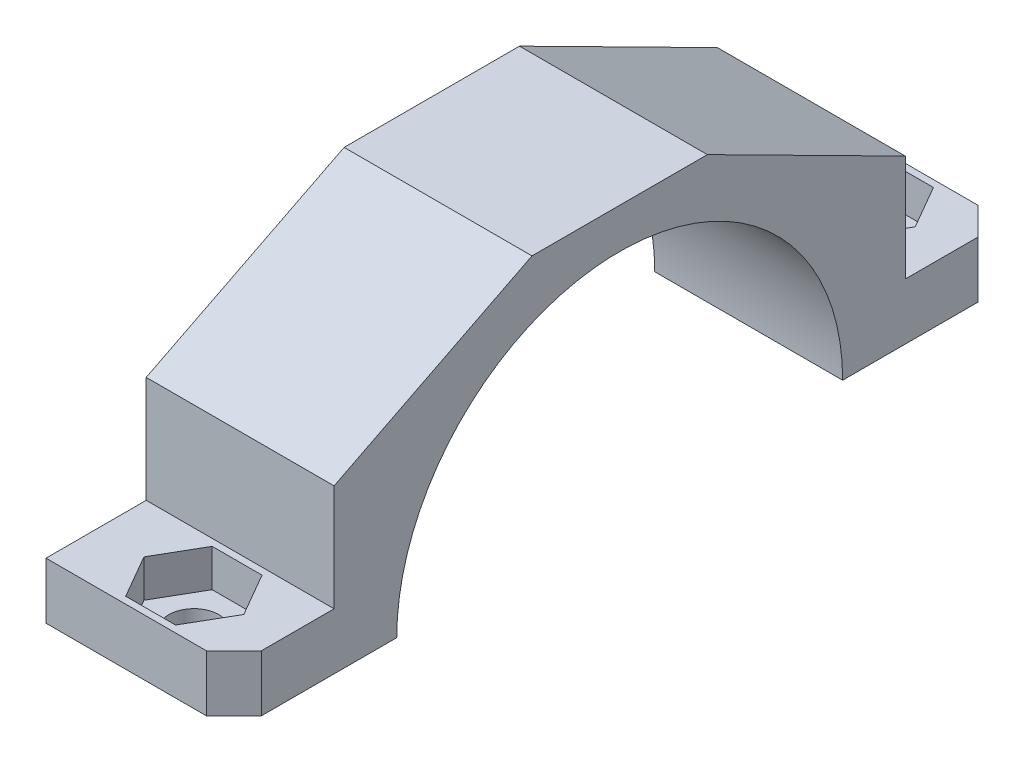
ISO-10303-21;
HEADER;
FILE_DESCRIPTION(('STEP AP214'),'2;1');
FILE_NAME('part.step','',(''),(''),'','','');
FILE_SCHEMA(('AUTOMOTIVE_DESIGN { 1 0 10303 214 1 1 1 1 }'));
ENDSEC;
DATA;
#1=APPLICATION_CONTEXT('core data for automotive mechanical design processes');
#2=APPLICATION_PROTOCOL_DEFINITION('international standard','automotive_design',2000,#1);
#3=PRODUCT_CONTEXT('',#1,'mechanical');
#4=PRODUCT('Part','Part','',(#3));
#5=PRODUCT_RELATED_PRODUCT_CATEGORY('part','',(#4));
#6=PRODUCT_DEFINITION_FORMATION('','',#4);
#7=PRODUCT_DEFINITION_CONTEXT('part definition',#1,'design');
#8=PRODUCT_DEFINITION('design','',#6,#7);
#9=PRODUCT_DEFINITION_SHAPE('','',#8);
#10=(LENGTH_UNIT() NAMED_UNIT(*) SI_UNIT(.MILLI.,.METRE.));
#11=(NAMED_UNIT(*) PLANE_ANGLE_UNIT() SI_UNIT($,.RADIAN.));
#12=(NAMED_UNIT(*) SI_UNIT($,.STERADIAN.) SOLID_ANGLE_UNIT());
#13=UNCERTAINTY_MEASURE_WITH_UNIT(LENGTH_MEASURE(1.E-05),#10,'distance_accuracy_value','');
#14=(GEOMETRIC_REPRESENTATION_CONTEXT(3) GLOBAL_UNCERTAINTY_ASSIGNED_CONTEXT((#13)) GLOBAL_UNIT_ASSIGNED_CONTEXT((#10,
#11,#12)) REPRESENTATION_CONTEXT('',''));
#15=CARTESIAN_POINT('',(0.,0.,0.));
#16=DIRECTION('',(0.,0.,1.));
#17=DIRECTION('',(1.,0.,0.));
#18=AXIS2_PLACEMENT_3D('',#15,#16,#17);
#19=CARTESIAN_POINT('',(0.30524949712385,-20.9999999999997,-26.7999999999997));
#20=DIRECTION('',(0.,-1.,0.));
#21=DIRECTION('',(0.,0.,-1.));
#22=AXIS2_PLACEMENT_3D('',#19,#20,#21);
#23=CYLINDRICAL_SURFACE('',#22,2.);
#24=CARTESIAN_POINT('',(0.30524949712385,0.,-26.7999999999997));
#25=DIRECTION('',(0.,1.,0.));
#26=DIRECTION('',(0.,0.,1.));
#27=AXIS2_PLACEMENT_3D('',#24,#25,#26);
#28=CIRCLE('',#27,2.);
#29=CARTESIAN_POINT('',(0.30524949712385,0.,-24.7999999999997));
#30=VERTEX_POINT('',#29);
#31=EDGE_CURVE('E316',#30,#30,#28,.T.);
#32=ORIENTED_EDGE('',*,*,#31,.F.);
#33=EDGE_LOOP('',(#32));
#34=FACE_BOUND('',#33,.T.);
#35=CARTESIAN_POINT('',(0.30524949712385,1.5,-26.7999999999997));
#36=DIRECTION('',(0.,1.,0.));
#37=DIRECTION('',(0.,0.,1.));
#38=AXIS2_PLACEMENT_3D('',#35,#36,#37);
#39=CIRCLE('',#38,2.);
#40=CARTESIAN_POINT('',(0.30524949712385,1.5,-24.7999999999997));
#41=VERTEX_POINT('',#40);
#42=EDGE_CURVE('E43',#41,#41,#39,.F.);
#43=ORIENTED_EDGE('',*,*,#42,.F.);
#44=EDGE_LOOP('',(#43));
#45=FACE_BOUND('',#44,.T.);
#46=ADVANCED_FACE('F39',(#34,#45),#23,.F.);
#47=CARTESIAN_POINT('',(0.30524949712385,-20.9999999999997,26.8000000000004));
#48=DIRECTION('',(0.,-1.,0.));
#49=DIRECTION('',(0.,0.,-1.));
#50=AXIS2_PLACEMENT_3D('',#47,#48,#49);
#51=CYLINDRICAL_SURFACE('',#50,2.);
#52=CARTESIAN_POINT('',(0.30524949712385,0.,26.8000000000004));
#53=DIRECTION('',(0.,1.,0.));
#54=DIRECTION('',(0.,0.,1.));
#55=AXIS2_PLACEMENT_3D('',#52,#53,#54);
#56=CIRCLE('',#55,2.);
#57=CARTESIAN_POINT('',(0.30524949712385,0.,28.8000000000004));
#58=VERTEX_POINT('',#57);
#59=EDGE_CURVE('E320',#58,#58,#56,.T.);
#60=ORIENTED_EDGE('',*,*,#59,.F.);
#61=EDGE_LOOP('',(#60));
#62=FACE_BOUND('',#61,.T.);
#63=CARTESIAN_POINT('',(0.30524949712385,1.5,26.8000000000004));
#64=DIRECTION('',(0.,1.,0.));
#65=DIRECTION('',(0.,0.,1.));
#66=AXIS2_PLACEMENT_3D('',#63,#64,#65);
#67=CIRCLE('',#66,2.);
#68=CARTESIAN_POINT('',(0.30524949712385,1.5,28.8000000000004));
#69=VERTEX_POINT('',#68);
#70=EDGE_CURVE('E262',#69,#69,#67,.F.);
#71=ORIENTED_EDGE('',*,*,#70,.F.);
#72=EDGE_LOOP('',(#71));
#73=FACE_BOUND('',#72,.T.);
#74=ADVANCED_FACE('F430',(#62,#73),#51,.F.);
#75=CARTESIAN_POINT('',(7.5,4.5,-22.8));
#76=DIRECTION('',(0.,-1.,0.));
#77=DIRECTION('',(0.,0.,-1.));
#78=AXIS2_PLACEMENT_3D('',#75,#76,#77);
#79=PLANE('',#78);
#80=DIRECTION('',(0.5,0.,0.866025403784439));
#81=VECTOR('',#80,1.);
#82=CARTESIAN_POINT('',(-3.67846736028479,4.5,-26.7999999999997));
#83=LINE('',#82,#81);
#84=CARTESIAN_POINT('',(-3.67846736028479,4.5,-26.7999999999997));
#85=VERTEX_POINT('',#84);
#86=CARTESIAN_POINT('',(-1.68660893158059,4.5,-23.3499999999997));
#87=VERTEX_POINT('',#86);
#88=EDGE_CURVE('E296',#85,#87,#83,.T.);
#89=ORIENTED_EDGE('',*,*,#88,.F.);
#90=DIRECTION('',(-0.5,0.,0.866025403784439));
#91=VECTOR('',#90,1.);
#92=CARTESIAN_POINT('',(-1.68660893158058,4.5,-30.2499999999997));
#93=LINE('',#92,#91);
#94=CARTESIAN_POINT('',(-1.68660893158058,4.5,-30.2499999999997));
#95=VERTEX_POINT('',#94);
#96=EDGE_CURVE('E56',#95,#85,#93,.T.);
#97=ORIENTED_EDGE('',*,*,#96,.F.);
#98=DIRECTION('',(-1.,0.,0.));
#99=VECTOR('',#98,1.);
#100=CARTESIAN_POINT('',(2.29710792582784,4.5,-30.2499999999997));
#101=LINE('',#100,#99);
#102=CARTESIAN_POINT('',(2.29710792582784,4.5,-30.2499999999997));
#103=VERTEX_POINT('',#102);
#104=EDGE_CURVE('E283',#103,#95,#101,.T.);
#105=ORIENTED_EDGE('',*,*,#104,.F.);
#106=DIRECTION('',(-0.5,0.,-0.866025403784439));
#107=VECTOR('',#106,1.);
#108=CARTESIAN_POINT('',(4.28896635453205,4.5,-26.7999999999997));
#109=LINE('',#108,#107);
#110=CARTESIAN_POINT('',(4.28896635453205,4.5,-26.7999999999997));
#111=VERTEX_POINT('',#110);
#112=EDGE_CURVE('E286',#111,#103,#109,.T.);
#113=ORIENTED_EDGE('',*,*,#112,.F.);
#114=DIRECTION('',(0.5,0.,-0.866025403784439));
#115=VECTOR('',#114,1.);
#116=CARTESIAN_POINT('',(2.29710792582784,4.5,-23.3499999999997));
#117=LINE('',#116,#115);
#118=CARTESIAN_POINT('',(2.29710792582784,4.5,-23.3499999999997));
#119=VERTEX_POINT('',#118);
#120=EDGE_CURVE('E290',#119,#111,#117,.T.);
#121=ORIENTED_EDGE('',*,*,#120,.F.);
#122=DIRECTION('',(1.,0.,0.));
#123=VECTOR('',#122,1.);
#124=CARTESIAN_POINT('',(-1.68660893158059,4.5,-23.3499999999997));
#125=LINE('',#124,#123);
#126=EDGE_CURVE('E293',#87,#119,#125,.T.);
#127=ORIENTED_EDGE('',*,*,#126,.F.);
#128=EDGE_LOOP('',(#89,#97,#105,#113,#121,#127));
#129=FACE_BOUND('',#128,.T.);
#130=DIRECTION('',(0.,0.,1.));
#131=VECTOR('',#130,1.);
#132=CARTESIAN_POINT('',(7.5,4.5,-22.8));
#133=LINE('',#132,#131);
#134=CARTESIAN_POINT('',(7.5,4.5,-28.6052494971222));
#135=VERTEX_POINT('',#134);
#136=CARTESIAN_POINT('',(7.5,4.5,-22.8));
#137=VERTEX_POINT('',#136);
#138=EDGE_CURVE('E352',#135,#137,#133,.T.);
#139=ORIENTED_EDGE('',*,*,#138,.F.);
#140=DIRECTION('',(-0.707106781186548,0.,-0.707106781186547));
#141=VECTOR('',#140,1.);
#142=CARTESIAN_POINT('',(10.4026247485611,4.5,-25.7026247485611));
#143=LINE('',#142,#141);
#144=CARTESIAN_POINT('',(5.30524949712216,4.50000000000001,-30.8));
#145=VERTEX_POINT('',#144);
#146=EDGE_CURVE('E332',#135,#145,#143,.T.);
#147=ORIENTED_EDGE('',*,*,#146,.T.);
#148=DIRECTION('',(-1.,0.,0.));
#149=VECTOR('',#148,1.);
#150=CARTESIAN_POINT('',(7.5,4.5,-30.8));
#151=LINE('',#150,#149);
#152=CARTESIAN_POINT('',(-7.5,4.5,-30.8));
#153=VERTEX_POINT('',#152);
#154=EDGE_CURVE('E399',#145,#153,#151,.T.);
#155=ORIENTED_EDGE('',*,*,#154,.T.);
#156=DIRECTION('',(0.,0.,1.));
#157=VECTOR('',#156,1.);
#158=CARTESIAN_POINT('',(-7.5,4.5,-22.8));
#159=LINE('',#158,#157);
#160=CARTESIAN_POINT('',(-7.5,4.5,-22.8));
#161=VERTEX_POINT('',#160);
#162=EDGE_CURVE('E381',#153,#161,#159,.T.);
#163=ORIENTED_EDGE('',*,*,#162,.T.);
#164=DIRECTION('',(-1.,0.,0.));
#165=VECTOR('',#164,1.);
#166=CARTESIAN_POINT('',(7.5,4.5,-22.8));
#167=LINE('',#166,#165);
#168=EDGE_CURVE('E396',#137,#161,#167,.T.);
#169=ORIENTED_EDGE('',*,*,#168,.F.);
#170=EDGE_LOOP('',(#139,#147,#155,#163,#169));
#171=FACE_BOUND('',#170,.T.);
#172=ADVANCED_FACE('F437',(#129,#171),#79,.F.);
#173=CARTESIAN_POINT('',(7.5,13.,22.8));
#174=DIRECTION('',(0.,-0.892157158155219,-0.451725143369731));
#175=DIRECTION('',(0.,0.451725143369731,-0.892157158155219));
#176=AXIS2_PLACEMENT_3D('',#173,#174,#175);
#177=PLANE('',#176);
#178=DIRECTION('',(0.,-0.451725143369731,0.892157158155219));
#179=VECTOR('',#178,1.);
#180=CARTESIAN_POINT('',(-7.5,13.,22.8));
#181=LINE('',#180,#179);
#182=CARTESIAN_POINT('',(-7.5,21.,7.));
#183=VERTEX_POINT('',#182);
#184=CARTESIAN_POINT('',(-7.5,13.,22.8));
#185=VERTEX_POINT('',#184);
#186=EDGE_CURVE('E335',#183,#185,#181,.T.);
#187=ORIENTED_EDGE('',*,*,#186,.T.);
#188=DIRECTION('',(-1.,0.,0.));
#189=VECTOR('',#188,1.);
#190=CARTESIAN_POINT('',(7.5,13.,22.8));
#191=LINE('',#190,#189);
#192=CARTESIAN_POINT('',(7.5,13.,22.8));
#193=VERTEX_POINT('',#192);
#194=EDGE_CURVE('E416',#193,#185,#191,.T.);
#195=ORIENTED_EDGE('',*,*,#194,.F.);
#196=DIRECTION('',(0.,-0.451725143369731,0.892157158155219));
#197=VECTOR('',#196,1.);
#198=CARTESIAN_POINT('',(7.5,13.,22.8));
#199=LINE('',#198,#197);
#200=CARTESIAN_POINT('',(7.5,21.,7.));
#201=VERTEX_POINT('',#200);
#202=EDGE_CURVE('E336',#201,#193,#199,.T.);
#203=ORIENTED_EDGE('',*,*,#202,.F.);
#204=DIRECTION('',(-1.,0.,0.));
#205=VECTOR('',#204,1.);
#206=CARTESIAN_POINT('',(7.5,21.,7.));
#207=LINE('',#206,#205);
#208=EDGE_CURVE('E360',#201,#183,#207,.T.);
#209=ORIENTED_EDGE('',*,*,#208,.T.);
#210=EDGE_LOOP('',(#187,#195,#203,#209));
#211=FACE_BOUND('',#210,.T.);
#212=ADVANCED_FACE('F41',(#211),#177,.F.);
#213=CARTESIAN_POINT('',(7.5,4.5,22.8));
#214=DIRECTION('',(0.,0.,-1.));
#215=DIRECTION('',(-1.,0.,0.));
#216=AXIS2_PLACEMENT_3D('',#213,#214,#215);
#217=PLANE('',#216);
#218=DIRECTION('',(0.,-1.,0.));
#219=VECTOR('',#218,1.);
#220=CARTESIAN_POINT('',(-7.5,4.5,22.8));
#221=LINE('',#220,#219);
#222=CARTESIAN_POINT('',(-7.5,4.5,22.8));
#223=VERTEX_POINT('',#222);
#224=EDGE_CURVE('E363',#185,#223,#221,.T.);
#225=ORIENTED_EDGE('',*,*,#224,.T.);
#226=DIRECTION('',(-1.,0.,0.));
#227=VECTOR('',#226,1.);
#228=CARTESIAN_POINT('',(7.5,4.5,22.8));
#229=LINE('',#228,#227);
#230=CARTESIAN_POINT('',(7.5,4.5,22.8));
#231=VERTEX_POINT('',#230);
#232=EDGE_CURVE('E413',#231,#223,#229,.T.);
#233=ORIENTED_EDGE('',*,*,#232,.F.);
#234=DIRECTION('',(0.,-1.,0.));
#235=VECTOR('',#234,1.);
#236=CARTESIAN_POINT('',(7.5,4.5,22.8));
#237=LINE('',#236,#235);
#238=EDGE_CURVE('E339',#193,#231,#237,.T.);
#239=ORIENTED_EDGE('',*,*,#238,.F.);
#240=ORIENTED_EDGE('',*,*,#194,.T.);
#241=EDGE_LOOP('',(#225,#233,#239,#240));
#242=FACE_BOUND('',#241,.T.);
#243=ADVANCED_FACE('F495',(#242),#217,.F.);
#244=CARTESIAN_POINT('',(7.5,4.5,30.8));
#245=DIRECTION('',(0.,-1.,0.));
#246=DIRECTION('',(0.,0.,-1.));
#247=AXIS2_PLACEMENT_3D('',#244,#245,#246);
#248=PLANE('',#247);
#249=DIRECTION('',(0.5,0.,0.866025403784439));
#250=VECTOR('',#249,1.);
#251=CARTESIAN_POINT('',(-3.67846736028479,4.5,26.8000000000004));
#252=LINE('',#251,#250);
#253=CARTESIAN_POINT('',(-3.6784673602848,4.5,26.8000000000004));
#254=VERTEX_POINT('',#253);
#255=CARTESIAN_POINT('',(-1.68660893158058,4.5,30.2500000000004));
#256=VERTEX_POINT('',#255);
#257=EDGE_CURVE('E250',#254,#256,#252,.T.);
#258=ORIENTED_EDGE('',*,*,#257,.F.);
#259=DIRECTION('',(-0.500000000000001,0.,0.866025403784438));
#260=VECTOR('',#259,1.);
#261=CARTESIAN_POINT('',(-1.68660893158058,4.5,23.3500000000004));
#262=LINE('',#261,#260);
#263=CARTESIAN_POINT('',(-1.68660893158058,4.5,23.3500000000004));
#264=VERTEX_POINT('',#263);
#265=EDGE_CURVE('E64',#264,#254,#262,.T.);
#266=ORIENTED_EDGE('',*,*,#265,.F.);
#267=DIRECTION('',(-1.,0.,0.));
#268=VECTOR('',#267,1.);
#269=CARTESIAN_POINT('',(2.29710792582784,4.5,23.3500000000004));
#270=LINE('',#269,#268);
#271=CARTESIAN_POINT('',(2.29710792582784,4.5,23.3500000000004));
#272=VERTEX_POINT('',#271);
#273=EDGE_CURVE('E236',#272,#264,#270,.T.);
#274=ORIENTED_EDGE('',*,*,#273,.F.);
#275=DIRECTION('',(-0.5,0.,-0.866025403784439));
#276=VECTOR('',#275,1.);
#277=CARTESIAN_POINT('',(4.28896635453205,4.5,26.8000000000004));
#278=LINE('',#277,#276);
#279=CARTESIAN_POINT('',(4.28896635453205,4.5,26.8000000000004));
#280=VERTEX_POINT('',#279);
#281=EDGE_CURVE('E239',#280,#272,#278,.T.);
#282=ORIENTED_EDGE('',*,*,#281,.F.);
#283=DIRECTION('',(0.5,0.,-0.866025403784439));
#284=VECTOR('',#283,1.);
#285=CARTESIAN_POINT('',(2.29710792582784,4.5,30.2500000000004));
#286=LINE('',#285,#284);
#287=CARTESIAN_POINT('',(2.29710792582784,4.5,30.2500000000004));
#288=VERTEX_POINT('',#287);
#289=EDGE_CURVE('E255',#288,#280,#286,.T.);
#290=ORIENTED_EDGE('',*,*,#289,.F.);
#291=DIRECTION('',(1.,0.,0.));
#292=VECTOR('',#291,1.);
#293=CARTESIAN_POINT('',(-1.68660893158058,4.5,30.2500000000004));
#294=LINE('',#293,#292);
#295=EDGE_CURVE('E252',#256,#288,#294,.T.);
#296=ORIENTED_EDGE('',*,*,#295,.F.);
#297=EDGE_LOOP('',(#258,#266,#274,#282,#290,#296));
#298=FACE_BOUND('',#297,.T.);
#299=DIRECTION('',(-1.,0.,0.));
#300=VECTOR('',#299,1.);
#301=CARTESIAN_POINT('',(7.5,4.5,30.8));
#302=LINE('',#301,#300);
#303=CARTESIAN_POINT('',(5.30524949712216,4.50000000000001,30.8));
#304=VERTEX_POINT('',#303);
#305=CARTESIAN_POINT('',(-7.5,4.5,30.8));
#306=VERTEX_POINT('',#305);
#307=EDGE_CURVE('E411',#304,#306,#302,.T.);
#308=ORIENTED_EDGE('',*,*,#307,.F.);
#309=DIRECTION('',(0.70710678118655,0.,-0.707106781186545));
#310=VECTOR('',#309,1.);
#311=CARTESIAN_POINT('',(6.40262474856109,4.5,29.7026247485611));
#312=LINE('',#311,#310);
#313=CARTESIAN_POINT('',(7.5,4.50000000000001,28.6052494971222));
#314=VERTEX_POINT('',#313);
#315=EDGE_CURVE('E327',#304,#314,#312,.T.);
#316=ORIENTED_EDGE('',*,*,#315,.T.);
#317=DIRECTION('',(0.,0.,1.));
#318=VECTOR('',#317,1.);
#319=CARTESIAN_POINT('',(7.5,4.5,30.8));
#320=LINE('',#319,#318);
#321=EDGE_CURVE('E342',#231,#314,#320,.T.);
#322=ORIENTED_EDGE('',*,*,#321,.F.);
#323=ORIENTED_EDGE('',*,*,#232,.T.);
#324=DIRECTION('',(0.,0.,1.));
#325=VECTOR('',#324,1.);
#326=CARTESIAN_POINT('',(-7.5,4.5,30.8));
#327=LINE('',#326,#325);
#328=EDGE_CURVE('E365',#223,#306,#327,.T.);
#329=ORIENTED_EDGE('',*,*,#328,.T.);
#330=EDGE_LOOP('',(#308,#316,#322,#323,#329));
#331=FACE_BOUND('',#330,.T.);
#332=ADVANCED_FACE('F492',(#298,#331),#248,.F.);
#333=CARTESIAN_POINT('',(7.5,0.,30.8));
#334=DIRECTION('',(0.,0.,-1.));
#335=DIRECTION('',(-1.,0.,0.));
#336=AXIS2_PLACEMENT_3D('',#333,#334,#335);
#337=PLANE('',#336);
#338=DIRECTION('',(-1.,0.,0.));
#339=VECTOR('',#338,1.);
#340=CARTESIAN_POINT('',(7.5,0.,30.8));
#341=LINE('',#340,#339);
#342=CARTESIAN_POINT('',(5.30524949712216,0.,30.8));
#343=VERTEX_POINT('',#342);
#344=CARTESIAN_POINT('',(-7.5,0.,30.8));
#345=VERTEX_POINT('',#344);
#346=EDGE_CURVE('E409',#343,#345,#341,.T.);
#347=ORIENTED_EDGE('',*,*,#346,.F.);
#348=DIRECTION('',(0.,-1.,0.));
#349=VECTOR('',#348,1.);
#350=CARTESIAN_POINT('',(5.30524949712216,21.,30.8));
#351=LINE('',#350,#349);
#352=EDGE_CURVE('E319',#304,#343,#351,.T.);
#353=ORIENTED_EDGE('',*,*,#352,.F.);
#354=ORIENTED_EDGE('',*,*,#307,.T.);
#355=DIRECTION('',(0.,-1.,0.));
#356=VECTOR('',#355,1.);
#357=CARTESIAN_POINT('',(-7.5,0.,30.8));
#358=LINE('',#357,#356);
#359=EDGE_CURVE('E368',#306,#345,#358,.T.);
#360=ORIENTED_EDGE('',*,*,#359,.T.);
#361=EDGE_LOOP('',(#347,#353,#354,#360));
#362=FACE_BOUND('',#361,.T.);
#363=ADVANCED_FACE('F488',(#362),#337,.F.);
#364=CARTESIAN_POINT('',(7.5,0.,30.8));
#365=DIRECTION('',(0.,1.,0.));
#366=DIRECTION('',(0.,0.,1.));
#367=AXIS2_PLACEMENT_3D('',#364,#365,#366);
#368=PLANE('',#367);
#369=ORIENTED_EDGE('',*,*,#59,.T.);
#370=EDGE_LOOP('',(#369));
#371=FACE_BOUND('',#370,.T.);
#372=DIRECTION('',(0.,0.,-1.));
#373=VECTOR('',#372,1.);
#374=CARTESIAN_POINT('',(7.5,0.,30.8));
#375=LINE('',#374,#373);
#376=CARTESIAN_POINT('',(7.5,0.,28.6052494971222));
#377=VERTEX_POINT('',#376);
#378=CARTESIAN_POINT('',(7.5,0.,17.8));
#379=VERTEX_POINT('',#378);
#380=EDGE_CURVE('E345',#377,#379,#375,.T.);
#381=ORIENTED_EDGE('',*,*,#380,.F.);
#382=DIRECTION('',(0.70710678118655,0.,-0.707106781186545));
#383=VECTOR('',#382,1.);
#384=CARTESIAN_POINT('',(5.30524949712216,0.,30.8));
#385=LINE('',#384,#383);
#386=EDGE_CURVE('E324',#343,#377,#385,.T.);
#387=ORIENTED_EDGE('',*,*,#386,.F.);
#388=ORIENTED_EDGE('',*,*,#346,.T.);
#389=DIRECTION('',(0.,0.,-1.));
#390=VECTOR('',#389,1.);
#391=CARTESIAN_POINT('',(-7.5,0.,30.8));
#392=LINE('',#391,#390);
#393=CARTESIAN_POINT('',(-7.5,0.,17.8));
#394=VERTEX_POINT('',#393);
#395=EDGE_CURVE('E371',#345,#394,#392,.T.);
#396=ORIENTED_EDGE('',*,*,#395,.T.);
#397=DIRECTION('',(-1.,0.,0.));
#398=VECTOR('',#397,1.);
#399=CARTESIAN_POINT('',(7.5,0.,17.8));
#400=LINE('',#399,#398);
#401=EDGE_CURVE('E406',#379,#394,#400,.T.);
#402=ORIENTED_EDGE('',*,*,#401,.F.);
#403=EDGE_LOOP('',(#381,#387,#388,#396,#402));
#404=FACE_BOUND('',#403,.T.);
#405=ADVANCED_FACE('F484',(#371,#404),#368,.F.);
#406=CARTESIAN_POINT('',(7.5,0.,0.));
#407=DIRECTION('',(-1.,0.,0.));
#408=DIRECTION('',(0.,0.,1.));
#409=AXIS2_PLACEMENT_3D('',#406,#407,#408);
#410=CYLINDRICAL_SURFACE('',#409,17.8);
#411=CARTESIAN_POINT('',(-7.5,0.,0.));
#412=DIRECTION('',(-1.,0.,0.));
#413=DIRECTION('',(0.,0.,1.));
#414=AXIS2_PLACEMENT_3D('',#411,#412,#413);
#415=CIRCLE('',#414,17.8);
#416=CARTESIAN_POINT('',(-7.5,0.,-17.8));
#417=VERTEX_POINT('',#416);
#418=EDGE_CURVE('E373',#394,#417,#415,.T.);
#419=ORIENTED_EDGE('',*,*,#418,.T.);
#420=DIRECTION('',(-1.,0.,0.));
#421=VECTOR('',#420,1.);
#422=CARTESIAN_POINT('',(7.5,0.,-17.8));
#423=LINE('',#422,#421);
#424=CARTESIAN_POINT('',(7.5,0.,-17.8));
#425=VERTEX_POINT('',#424);
#426=EDGE_CURVE('E403',#425,#417,#423,.T.);
#427=ORIENTED_EDGE('',*,*,#426,.F.);
#428=CARTESIAN_POINT('',(7.5,0.,0.));
#429=DIRECTION('',(-1.,0.,0.));
#430=DIRECTION('',(0.,0.,1.));
#431=AXIS2_PLACEMENT_3D('',#428,#429,#430);
#432=CIRCLE('',#431,17.8);
#433=EDGE_CURVE('E347',#379,#425,#432,.T.);
#434=ORIENTED_EDGE('',*,*,#433,.F.);
#435=ORIENTED_EDGE('',*,*,#401,.T.);
#436=EDGE_LOOP('',(#419,#427,#434,#435));
#437=FACE_BOUND('',#436,.T.);
#438=ADVANCED_FACE('F480',(#437),#410,.F.);
#439=CARTESIAN_POINT('',(7.5,0.,-17.8));
#440=DIRECTION('',(0.,1.,0.));
#441=DIRECTION('',(0.,0.,1.));
#442=AXIS2_PLACEMENT_3D('',#439,#440,#441);
#443=PLANE('',#442);
#444=ORIENTED_EDGE('',*,*,#31,.T.);
#445=EDGE_LOOP('',(#444));
#446=FACE_BOUND('',#445,.T.);
#447=DIRECTION('',(-1.,0.,0.));
#448=VECTOR('',#447,1.);
#449=CARTESIAN_POINT('',(7.5,0.,-30.8));
#450=LINE('',#449,#448);
#451=CARTESIAN_POINT('',(5.30524949712216,0.,-30.8));
#452=VERTEX_POINT('',#451);
#453=CARTESIAN_POINT('',(-7.5,0.,-30.8));
#454=VERTEX_POINT('',#453);
#455=EDGE_CURVE('E401',#452,#454,#450,.T.);
#456=ORIENTED_EDGE('',*,*,#455,.F.);
#457=DIRECTION('',(-0.707106781186548,0.,-0.707106781186547));
#458=VECTOR('',#457,1.);
#459=CARTESIAN_POINT('',(5.30524949712216,0.,-30.8));
#460=LINE('',#459,#458);
#461=CARTESIAN_POINT('',(7.5,0.,-28.6052494971222));
#462=VERTEX_POINT('',#461);
#463=EDGE_CURVE('E321',#462,#452,#460,.T.);
#464=ORIENTED_EDGE('',*,*,#463,.F.);
#465=DIRECTION('',(0.,0.,-1.));
#466=VECTOR('',#465,1.);
#467=CARTESIAN_POINT('',(7.5,0.,-17.8));
#468=LINE('',#467,#466);
#469=EDGE_CURVE('E349',#425,#462,#468,.T.);
#470=ORIENTED_EDGE('',*,*,#469,.F.);
#471=ORIENTED_EDGE('',*,*,#426,.T.);
#472=DIRECTION('',(0.,0.,-1.));
#473=VECTOR('',#472,1.);
#474=CARTESIAN_POINT('',(-7.5,0.,-17.8));
#475=LINE('',#474,#473);
#476=EDGE_CURVE('E375',#417,#454,#475,.T.);
#477=ORIENTED_EDGE('',*,*,#476,.T.);
#478=EDGE_LOOP('',(#456,#464,#470,#471,#477));
#479=FACE_BOUND('',#478,.T.);
#480=ADVANCED_FACE('F477',(#446,#479),#443,.F.);
#481=CARTESIAN_POINT('',(7.5,4.5,-30.8));
#482=DIRECTION('',(0.,0.,1.));
#483=DIRECTION('',(1.,0.,0.));
#484=AXIS2_PLACEMENT_3D('',#481,#482,#483);
#485=PLANE('',#484);
#486=ORIENTED_EDGE('',*,*,#154,.F.);
#487=DIRECTION('',(0.,-1.,0.));
#488=VECTOR('',#487,1.);
#489=CARTESIAN_POINT('',(5.30524949712216,21.,-30.8));
#490=LINE('',#489,#488);
#491=EDGE_CURVE('E323',#145,#452,#490,.T.);
#492=ORIENTED_EDGE('',*,*,#491,.T.);
#493=ORIENTED_EDGE('',*,*,#455,.T.);
#494=DIRECTION('',(0.,1.,0.));
#495=VECTOR('',#494,1.);
#496=CARTESIAN_POINT('',(-7.5,4.5,-30.8));
#497=LINE('',#496,#495);
#498=EDGE_CURVE('E378',#454,#153,#497,.T.);
#499=ORIENTED_EDGE('',*,*,#498,.T.);
#500=EDGE_LOOP('',(#486,#492,#493,#499));
#501=FACE_BOUND('',#500,.T.);
#502=ADVANCED_FACE('F470',(#501),#485,.F.);
#503=CARTESIAN_POINT('',(7.5,13.,-22.8));
#504=DIRECTION('',(0.,0.,1.));
#505=DIRECTION('',(1.,0.,0.));
#506=AXIS2_PLACEMENT_3D('',#503,#504,#505);
#507=PLANE('',#506);
#508=DIRECTION('',(0.,1.,0.));
#509=VECTOR('',#508,1.);
#510=CARTESIAN_POINT('',(-7.5,13.,-22.8));
#511=LINE('',#510,#509);
#512=CARTESIAN_POINT('',(-7.5,13.,-22.8));
#513=VERTEX_POINT('',#512);
#514=EDGE_CURVE('E383',#161,#513,#511,.T.);
#515=ORIENTED_EDGE('',*,*,#514,.T.);
#516=DIRECTION('',(-1.,0.,0.));
#517=VECTOR('',#516,1.);
#518=CARTESIAN_POINT('',(7.5,13.,-22.8));
#519=LINE('',#518,#517);
#520=CARTESIAN_POINT('',(7.5,13.,-22.8));
#521=VERTEX_POINT('',#520);
#522=EDGE_CURVE('E393',#521,#513,#519,.T.);
#523=ORIENTED_EDGE('',*,*,#522,.F.);
#524=DIRECTION('',(0.,1.,0.));
#525=VECTOR('',#524,1.);
#526=CARTESIAN_POINT('',(7.5,13.,-22.8));
#527=LINE('',#526,#525);
#528=EDGE_CURVE('E354',#137,#521,#527,.T.);
#529=ORIENTED_EDGE('',*,*,#528,.F.);
#530=ORIENTED_EDGE('',*,*,#168,.T.);
#531=EDGE_LOOP('',(#515,#523,#529,#530));
#532=FACE_BOUND('',#531,.T.);
#533=ADVANCED_FACE('F466',(#532),#507,.F.);
#534=CARTESIAN_POINT('',(7.5,21.,-7.));
#535=DIRECTION('',(0.,-0.892157158155219,0.451725143369731));
#536=DIRECTION('',(0.,-0.451725143369731,-0.892157158155219));
#537=AXIS2_PLACEMENT_3D('',#534,#535,#536);
#538=PLANE('',#537);
#539=DIRECTION('',(0.,0.451725143369731,0.892157158155219));
#540=VECTOR('',#539,1.);
#541=CARTESIAN_POINT('',(-7.5,21.,-7.));
#542=LINE('',#541,#540);
#543=CARTESIAN_POINT('',(-7.5,21.,-7.));
#544=VERTEX_POINT('',#543);
#545=EDGE_CURVE('E385',#513,#544,#542,.T.);
#546=ORIENTED_EDGE('',*,*,#545,.T.);
#547=DIRECTION('',(-1.,0.,0.));
#548=VECTOR('',#547,1.);
#549=CARTESIAN_POINT('',(7.5,21.,-7.));
#550=LINE('',#549,#548);
#551=CARTESIAN_POINT('',(7.5,21.,-7.));
#552=VERTEX_POINT('',#551);
#553=EDGE_CURVE('E390',#552,#544,#550,.T.);
#554=ORIENTED_EDGE('',*,*,#553,.F.);
#555=DIRECTION('',(0.,0.451725143369731,0.892157158155219));
#556=VECTOR('',#555,1.);
#557=CARTESIAN_POINT('',(7.5,21.,-7.));
#558=LINE('',#557,#556);
#559=EDGE_CURVE('E356',#521,#552,#558,.T.);
#560=ORIENTED_EDGE('',*,*,#559,.F.);
#561=ORIENTED_EDGE('',*,*,#522,.T.);
#562=EDGE_LOOP('',(#546,#554,#560,#561));
#563=FACE_BOUND('',#562,.T.);
#564=ADVANCED_FACE('F462',(#563),#538,.F.);
#565=CARTESIAN_POINT('',(7.5,21.,7.));
#566=DIRECTION('',(0.,-1.,0.));
#567=DIRECTION('',(0.,0.,-1.));
#568=AXIS2_PLACEMENT_3D('',#565,#566,#567);
#569=PLANE('',#568);
#570=DIRECTION('',(0.,0.,1.));
#571=VECTOR('',#570,1.);
#572=CARTESIAN_POINT('',(-7.5,21.,7.));
#573=LINE('',#572,#571);
#574=EDGE_CURVE('E340',#544,#183,#573,.T.);
#575=ORIENTED_EDGE('',*,*,#574,.T.);
#576=ORIENTED_EDGE('',*,*,#208,.F.);
#577=DIRECTION('',(0.,0.,1.));
#578=VECTOR('',#577,1.);
#579=CARTESIAN_POINT('',(7.5,21.,7.));
#580=LINE('',#579,#578);
#581=EDGE_CURVE('E358',#552,#201,#580,.T.);
#582=ORIENTED_EDGE('',*,*,#581,.F.);
#583=ORIENTED_EDGE('',*,*,#553,.T.);
#584=EDGE_LOOP('',(#575,#576,#582,#583));
#585=FACE_BOUND('',#584,.T.);
#586=ADVANCED_FACE('F455',(#585),#569,.F.);
#587=CARTESIAN_POINT('',(7.5,0.,0.));
#588=DIRECTION('',(-1.,0.,0.));
#589=DIRECTION('',(0.,0.,1.));
#590=AXIS2_PLACEMENT_3D('',#587,#588,#589);
#591=PLANE('',#590);
#592=ORIENTED_EDGE('',*,*,#469,.T.);
#593=DIRECTION('',(0.,1.,0.));
#594=VECTOR('',#593,1.);
#595=CARTESIAN_POINT('',(7.5,0.,-28.6052494971222));
#596=LINE('',#595,#594);
#597=EDGE_CURVE('E11',#462,#135,#596,.T.);
#598=ORIENTED_EDGE('',*,*,#597,.T.);
#599=ORIENTED_EDGE('',*,*,#138,.T.);
#600=ORIENTED_EDGE('',*,*,#528,.T.);
#601=ORIENTED_EDGE('',*,*,#559,.T.);
#602=ORIENTED_EDGE('',*,*,#581,.T.);
#603=ORIENTED_EDGE('',*,*,#202,.T.);
#604=ORIENTED_EDGE('',*,*,#238,.T.);
#605=ORIENTED_EDGE('',*,*,#321,.T.);
#606=DIRECTION('',(0.,-1.,0.));
#607=VECTOR('',#606,1.);
#608=CARTESIAN_POINT('',(7.5,0.,28.6052494971222));
#609=LINE('',#608,#607);
#610=EDGE_CURVE('E48',#314,#377,#609,.T.);
#611=ORIENTED_EDGE('',*,*,#610,.T.);
#612=ORIENTED_EDGE('',*,*,#380,.T.);
#613=ORIENTED_EDGE('',*,*,#433,.T.);
#614=EDGE_LOOP('',(#592,#598,#599,#600,#601,#602,#603,#604,#605,#611,#612,#613));
#615=FACE_BOUND('',#614,.T.);
#616=ADVANCED_FACE('F452',(#615),#591,.F.);
#617=CARTESIAN_POINT('',(-7.5,0.,0.));
#618=DIRECTION('',(-1.,0.,0.));
#619=DIRECTION('',(0.,0.,1.));
#620=AXIS2_PLACEMENT_3D('',#617,#618,#619);
#621=PLANE('',#620);
#622=ORIENTED_EDGE('',*,*,#186,.F.);
#623=ORIENTED_EDGE('',*,*,#574,.F.);
#624=ORIENTED_EDGE('',*,*,#545,.F.);
#625=ORIENTED_EDGE('',*,*,#514,.F.);
#626=ORIENTED_EDGE('',*,*,#162,.F.);
#627=ORIENTED_EDGE('',*,*,#498,.F.);
#628=ORIENTED_EDGE('',*,*,#476,.F.);
#629=ORIENTED_EDGE('',*,*,#418,.F.);
#630=ORIENTED_EDGE('',*,*,#395,.F.);
#631=ORIENTED_EDGE('',*,*,#359,.F.);
#632=ORIENTED_EDGE('',*,*,#328,.F.);
#633=ORIENTED_EDGE('',*,*,#224,.F.);
#634=EDGE_LOOP('',(#622,#623,#624,#625,#626,#627,#628,#629,#630,#631,#632,#633));
#635=FACE_BOUND('',#634,.T.);
#636=ADVANCED_FACE('F450',(#635),#621,.T.);
#637=CARTESIAN_POINT('',(5.30524949712216,21.,30.8));
#638=DIRECTION('',(-0.707106781186545,0.,-0.70710678118655));
#639=DIRECTION('',(-0.70710678118655,0.,0.707106781186545));
#640=AXIS2_PLACEMENT_3D('',#637,#638,#639);
#641=PLANE('',#640);
#642=ORIENTED_EDGE('',*,*,#352,.T.);
#643=ORIENTED_EDGE('',*,*,#386,.T.);
#644=ORIENTED_EDGE('',*,*,#610,.F.);
#645=ORIENTED_EDGE('',*,*,#315,.F.);
#646=EDGE_LOOP('',(#642,#643,#644,#645));
#647=FACE_BOUND('',#646,.T.);
#648=ADVANCED_FACE('F446',(#647),#641,.F.);
#649=CARTESIAN_POINT('',(5.30524949712216,21.,-30.8));
#650=DIRECTION('',(-0.707106781186547,0.,0.707106781186548));
#651=DIRECTION('',(0.707106781186548,0.,0.707106781186547));
#652=AXIS2_PLACEMENT_3D('',#649,#650,#651);
#653=PLANE('',#652);
#654=ORIENTED_EDGE('',*,*,#597,.F.);
#655=ORIENTED_EDGE('',*,*,#463,.T.);
#656=ORIENTED_EDGE('',*,*,#491,.F.);
#657=ORIENTED_EDGE('',*,*,#146,.F.);
#658=EDGE_LOOP('',(#654,#655,#656,#657));
#659=FACE_BOUND('',#658,.T.);
#660=ADVANCED_FACE('F443',(#659),#653,.F.);
#661=CARTESIAN_POINT('',(0.,1.5,0.));
#662=DIRECTION('',(0.,1.,0.));
#663=DIRECTION('',(0.,0.,1.));
#664=AXIS2_PLACEMENT_3D('',#661,#662,#663);
#665=PLANE('',#664);
#666=DIRECTION('',(-0.500000000000001,0.,0.866025403784438));
#667=VECTOR('',#666,1.);
#668=CARTESIAN_POINT('',(-1.68660893158058,1.5,23.3500000000004));
#669=LINE('',#668,#667);
#670=CARTESIAN_POINT('',(-1.68660893158058,1.5,23.3500000000004));
#671=VERTEX_POINT('',#670);
#672=CARTESIAN_POINT('',(-3.67846736028479,1.5,26.8000000000004));
#673=VERTEX_POINT('',#672);
#674=EDGE_CURVE('E216',#671,#673,#669,.T.);
#675=ORIENTED_EDGE('',*,*,#674,.T.);
#676=DIRECTION('',(0.5,0.,0.866025403784439));
#677=VECTOR('',#676,1.);
#678=CARTESIAN_POINT('',(-3.67846736028479,1.5,26.8000000000004));
#679=LINE('',#678,#677);
#680=CARTESIAN_POINT('',(-1.68660893158058,1.5,30.2500000000004));
#681=VERTEX_POINT('',#680);
#682=EDGE_CURVE('E225',#673,#681,#679,.T.);
#683=ORIENTED_EDGE('',*,*,#682,.T.);
#684=DIRECTION('',(1.,0.,0.));
#685=VECTOR('',#684,1.);
#686=CARTESIAN_POINT('',(-1.68660893158058,1.5,30.2500000000004));
#687=LINE('',#686,#685);
#688=CARTESIAN_POINT('',(2.29710792582784,1.5,30.2500000000004));
#689=VERTEX_POINT('',#688);
#690=EDGE_CURVE('E230',#681,#689,#687,.T.);
#691=ORIENTED_EDGE('',*,*,#690,.T.);
#692=DIRECTION('',(0.5,0.,-0.866025403784439));
#693=VECTOR('',#692,1.);
#694=CARTESIAN_POINT('',(2.29710792582784,1.5,30.2500000000004));
#695=LINE('',#694,#693);
#696=CARTESIAN_POINT('',(4.28896635453205,1.5,26.8000000000004));
#697=VERTEX_POINT('',#696);
#698=EDGE_CURVE('E243',#689,#697,#695,.T.);
#699=ORIENTED_EDGE('',*,*,#698,.T.);
#700=DIRECTION('',(-0.5,0.,-0.866025403784439));
#701=VECTOR('',#700,1.);
#702=CARTESIAN_POINT('',(4.28896635453205,1.5,26.8000000000004));
#703=LINE('',#702,#701);
#704=CARTESIAN_POINT('',(2.29710792582784,1.5,23.3500000000004));
#705=VERTEX_POINT('',#704);
#706=EDGE_CURVE('E246',#697,#705,#703,.T.);
#707=ORIENTED_EDGE('',*,*,#706,.T.);
#708=DIRECTION('',(-1.,0.,0.));
#709=VECTOR('',#708,1.);
#710=CARTESIAN_POINT('',(2.29710792582784,1.5,23.3500000000004));
#711=LINE('',#710,#709);
#712=EDGE_CURVE('E222',#705,#671,#711,.T.);
#713=ORIENTED_EDGE('',*,*,#712,.T.);
#714=EDGE_LOOP('',(#675,#683,#691,#699,#707,#713));
#715=FACE_BOUND('',#714,.T.);
#716=ORIENTED_EDGE('',*,*,#70,.T.);
#717=EDGE_LOOP('',(#716));
#718=FACE_BOUND('',#717,.T.);
#719=ADVANCED_FACE('F232',(#715,#718),#665,.T.);
#720=CARTESIAN_POINT('',(-1.68660893158058,1.5,23.3500000000004));
#721=DIRECTION('',(-0.866025403784438,0.,-0.500000000000001));
#722=DIRECTION('',(-0.500000000000001,0.,0.866025403784438));
#723=AXIS2_PLACEMENT_3D('',#720,#721,#722);
#724=PLANE('',#723);
#725=ORIENTED_EDGE('',*,*,#265,.T.);
#726=DIRECTION('',(0.,1.,0.));
#727=VECTOR('',#726,1.);
#728=CARTESIAN_POINT('',(-3.67846736028479,1.5,26.8000000000004));
#729=LINE('',#728,#727);
#730=EDGE_CURVE('E212',#673,#254,#729,.T.);
#731=ORIENTED_EDGE('',*,*,#730,.F.);
#732=ORIENTED_EDGE('',*,*,#674,.F.);
#733=DIRECTION('',(0.,1.,0.));
#734=VECTOR('',#733,1.);
#735=CARTESIAN_POINT('',(-1.68660893158058,1.5,23.3500000000004));
#736=LINE('',#735,#734);
#737=EDGE_CURVE('E260',#671,#264,#736,.T.);
#738=ORIENTED_EDGE('',*,*,#737,.T.);
#739=EDGE_LOOP('',(#725,#731,#732,#738));
#740=FACE_BOUND('',#739,.T.);
#741=ADVANCED_FACE('F214',(#740),#724,.F.);
#742=CARTESIAN_POINT('',(2.29710792582784,1.5,23.3500000000004));
#743=DIRECTION('',(0.,0.,-1.));
#744=DIRECTION('',(-1.,0.,0.));
#745=AXIS2_PLACEMENT_3D('',#742,#743,#744);
#746=PLANE('',#745);
#747=ORIENTED_EDGE('',*,*,#273,.T.);
#748=ORIENTED_EDGE('',*,*,#737,.F.);
#749=ORIENTED_EDGE('',*,*,#712,.F.);
#750=DIRECTION('',(0.,1.,0.));
#751=VECTOR('',#750,1.);
#752=CARTESIAN_POINT('',(2.29710792582784,1.5,23.3500000000004));
#753=LINE('',#752,#751);
#754=EDGE_CURVE('E263',#705,#272,#753,.T.);
#755=ORIENTED_EDGE('',*,*,#754,.T.);
#756=EDGE_LOOP('',(#747,#748,#749,#755));
#757=FACE_BOUND('',#756,.T.);
#758=ADVANCED_FACE('F658',(#757),#746,.F.);
#759=CARTESIAN_POINT('',(4.28896635453205,1.5,26.8000000000004));
#760=DIRECTION('',(0.866025403784439,0.,-0.5));
#761=DIRECTION('',(-0.5,0.,-0.866025403784439));
#762=AXIS2_PLACEMENT_3D('',#759,#760,#761);
#763=PLANE('',#762);
#764=ORIENTED_EDGE('',*,*,#281,.T.);
#765=ORIENTED_EDGE('',*,*,#754,.F.);
#766=ORIENTED_EDGE('',*,*,#706,.F.);
#767=DIRECTION('',(0.,1.,0.));
#768=VECTOR('',#767,1.);
#769=CARTESIAN_POINT('',(4.28896635453205,1.5,26.8000000000004));
#770=LINE('',#769,#768);
#771=EDGE_CURVE('E265',#697,#280,#770,.T.);
#772=ORIENTED_EDGE('',*,*,#771,.T.);
#773=EDGE_LOOP('',(#764,#765,#766,#772));
#774=FACE_BOUND('',#773,.T.);
#775=ADVANCED_FACE('F667',(#774),#763,.F.);
#776=CARTESIAN_POINT('',(2.29710792582784,1.5,30.2500000000004));
#777=DIRECTION('',(0.866025403784439,0.,0.5));
#778=DIRECTION('',(0.5,0.,-0.866025403784439));
#779=AXIS2_PLACEMENT_3D('',#776,#777,#778);
#780=PLANE('',#779);
#781=ORIENTED_EDGE('',*,*,#289,.T.);
#782=ORIENTED_EDGE('',*,*,#771,.F.);
#783=ORIENTED_EDGE('',*,*,#698,.F.);
#784=DIRECTION('',(0.,1.,0.));
#785=VECTOR('',#784,1.);
#786=CARTESIAN_POINT('',(2.29710792582784,1.5,30.2500000000004));
#787=LINE('',#786,#785);
#788=EDGE_CURVE('E267',#689,#288,#787,.T.);
#789=ORIENTED_EDGE('',*,*,#788,.T.);
#790=EDGE_LOOP('',(#781,#782,#783,#789));
#791=FACE_BOUND('',#790,.T.);
#792=ADVANCED_FACE('F677',(#791),#780,.F.);
#793=CARTESIAN_POINT('',(-1.68660893158058,1.5,30.2500000000004));
#794=DIRECTION('',(0.,0.,1.));
#795=DIRECTION('',(1.,0.,0.));
#796=AXIS2_PLACEMENT_3D('',#793,#794,#795);
#797=PLANE('',#796);
#798=ORIENTED_EDGE('',*,*,#295,.T.);
#799=ORIENTED_EDGE('',*,*,#788,.F.);
#800=ORIENTED_EDGE('',*,*,#690,.F.);
#801=DIRECTION('',(0.,1.,0.));
#802=VECTOR('',#801,1.);
#803=CARTESIAN_POINT('',(-1.68660893158058,1.5,30.2500000000004));
#804=LINE('',#803,#802);
#805=EDGE_CURVE('E221',#681,#256,#804,.T.);
#806=ORIENTED_EDGE('',*,*,#805,.T.);
#807=EDGE_LOOP('',(#798,#799,#800,#806));
#808=FACE_BOUND('',#807,.T.);
#809=ADVANCED_FACE('F687',(#808),#797,.F.);
#810=CARTESIAN_POINT('',(-3.67846736028479,1.5,26.8000000000004));
#811=DIRECTION('',(-0.866025403784438,0.,0.5));
#812=DIRECTION('',(0.5,0.,0.866025403784439));
#813=AXIS2_PLACEMENT_3D('',#810,#811,#812);
#814=PLANE('',#813);
#815=ORIENTED_EDGE('',*,*,#257,.T.);
#816=ORIENTED_EDGE('',*,*,#805,.F.);
#817=ORIENTED_EDGE('',*,*,#682,.F.);
#818=ORIENTED_EDGE('',*,*,#730,.T.);
#819=EDGE_LOOP('',(#815,#816,#817,#818));
#820=FACE_BOUND('',#819,.T.);
#821=ADVANCED_FACE('F226',(#820),#814,.F.);
#822=CARTESIAN_POINT('',(0.,1.5,0.));
#823=DIRECTION('',(0.,1.,0.));
#824=DIRECTION('',(0.,0.,1.));
#825=AXIS2_PLACEMENT_3D('',#822,#823,#824);
#826=PLANE('',#825);
#827=DIRECTION('',(-0.5,0.,0.866025403784439));
#828=VECTOR('',#827,1.);
#829=CARTESIAN_POINT('',(-1.68660893158058,1.5,-30.2499999999997));
#830=LINE('',#829,#828);
#831=CARTESIAN_POINT('',(-1.68660893158058,1.5,-30.2499999999997));
#832=VERTEX_POINT('',#831);
#833=CARTESIAN_POINT('',(-3.67846736028479,1.5,-26.7999999999997));
#834=VERTEX_POINT('',#833);
#835=EDGE_CURVE('E287',#832,#834,#830,.T.);
#836=ORIENTED_EDGE('',*,*,#835,.T.);
#837=DIRECTION('',(0.5,0.,0.866025403784439));
#838=VECTOR('',#837,1.);
#839=CARTESIAN_POINT('',(-3.67846736028479,1.5,-26.7999999999997));
#840=LINE('',#839,#838);
#841=CARTESIAN_POINT('',(-1.68660893158059,1.5,-23.3499999999997));
#842=VERTEX_POINT('',#841);
#843=EDGE_CURVE('E311',#834,#842,#840,.T.);
#844=ORIENTED_EDGE('',*,*,#843,.T.);
#845=DIRECTION('',(1.,0.,0.));
#846=VECTOR('',#845,1.);
#847=CARTESIAN_POINT('',(-1.68660893158059,1.5,-23.3499999999997));
#848=LINE('',#847,#846);
#849=CARTESIAN_POINT('',(2.29710792582784,1.5,-23.3499999999997));
#850=VERTEX_POINT('',#849);
#851=EDGE_CURVE('E308',#842,#850,#848,.T.);
#852=ORIENTED_EDGE('',*,*,#851,.T.);
#853=DIRECTION('',(0.5,0.,-0.866025403784439));
#854=VECTOR('',#853,1.);
#855=CARTESIAN_POINT('',(2.29710792582784,1.5,-23.3499999999997));
#856=LINE('',#855,#854);
#857=CARTESIAN_POINT('',(4.28896635453205,1.5,-26.7999999999997));
#858=VERTEX_POINT('',#857);
#859=EDGE_CURVE('E305',#850,#858,#856,.T.);
#860=ORIENTED_EDGE('',*,*,#859,.T.);
#861=DIRECTION('',(-0.5,0.,-0.866025403784439));
#862=VECTOR('',#861,1.);
#863=CARTESIAN_POINT('',(4.28896635453205,1.5,-26.7999999999997));
#864=LINE('',#863,#862);
#865=CARTESIAN_POINT('',(2.29710792582784,1.5,-30.2499999999997));
#866=VERTEX_POINT('',#865);
#867=EDGE_CURVE('E302',#858,#866,#864,.T.);
#868=ORIENTED_EDGE('',*,*,#867,.T.);
#869=DIRECTION('',(-1.,0.,0.));
#870=VECTOR('',#869,1.);
#871=CARTESIAN_POINT('',(2.29710792582784,1.5,-30.2499999999997));
#872=LINE('',#871,#870);
#873=EDGE_CURVE('E272',#866,#832,#872,.T.);
#874=ORIENTED_EDGE('',*,*,#873,.T.);
#875=EDGE_LOOP('',(#836,#844,#852,#860,#868,#874));
#876=FACE_BOUND('',#875,.T.);
#877=ORIENTED_EDGE('',*,*,#42,.T.);
#878=EDGE_LOOP('',(#877));
#879=FACE_BOUND('',#878,.T.);
#880=ADVANCED_FACE('F427',(#876,#879),#826,.T.);
#881=CARTESIAN_POINT('',(-1.68660893158058,1.5,-30.2499999999997));
#882=DIRECTION('',(-0.866025403784439,0.,-0.5));
#883=DIRECTION('',(-0.5,0.,0.866025403784439));
#884=AXIS2_PLACEMENT_3D('',#881,#882,#883);
#885=PLANE('',#884);
#886=ORIENTED_EDGE('',*,*,#96,.T.);
#887=DIRECTION('',(0.,1.,0.));
#888=VECTOR('',#887,1.);
#889=CARTESIAN_POINT('',(-3.67846736028479,1.5,-26.7999999999997));
#890=LINE('',#889,#888);
#891=EDGE_CURVE('E270',#834,#85,#890,.T.);
#892=ORIENTED_EDGE('',*,*,#891,.F.);
#893=ORIENTED_EDGE('',*,*,#835,.F.);
#894=DIRECTION('',(0.,1.,0.));
#895=VECTOR('',#894,1.);
#896=CARTESIAN_POINT('',(-1.68660893158058,1.5,-30.2499999999997));
#897=LINE('',#896,#895);
#898=EDGE_CURVE('E281',#832,#95,#897,.T.);
#899=ORIENTED_EDGE('',*,*,#898,.T.);
#900=EDGE_LOOP('',(#886,#892,#893,#899));
#901=FACE_BOUND('',#900,.T.);
#902=ADVANCED_FACE('F714',(#901),#885,.F.);
#903=CARTESIAN_POINT('',(2.29710792582784,1.5,-30.2499999999997));
#904=DIRECTION('',(0.,0.,-1.));
#905=DIRECTION('',(-1.,0.,0.));
#906=AXIS2_PLACEMENT_3D('',#903,#904,#905);
#907=PLANE('',#906);
#908=ORIENTED_EDGE('',*,*,#104,.T.);
#909=ORIENTED_EDGE('',*,*,#898,.F.);
#910=ORIENTED_EDGE('',*,*,#873,.F.);
#911=DIRECTION('',(0.,1.,0.));
#912=VECTOR('',#911,1.);
#913=CARTESIAN_POINT('',(2.29710792582784,1.5,-30.2499999999997));
#914=LINE('',#913,#912);
#915=EDGE_CURVE('E279',#866,#103,#914,.T.);
#916=ORIENTED_EDGE('',*,*,#915,.T.);
#917=EDGE_LOOP('',(#908,#909,#910,#916));
#918=FACE_BOUND('',#917,.T.);
#919=ADVANCED_FACE('F723',(#918),#907,.F.);
#920=CARTESIAN_POINT('',(4.28896635453205,1.5,-26.7999999999997));
#921=DIRECTION('',(0.866025403784439,0.,-0.5));
#922=DIRECTION('',(-0.5,0.,-0.866025403784439));
#923=AXIS2_PLACEMENT_3D('',#920,#921,#922);
#924=PLANE('',#923);
#925=ORIENTED_EDGE('',*,*,#112,.T.);
#926=ORIENTED_EDGE('',*,*,#915,.F.);
#927=ORIENTED_EDGE('',*,*,#867,.F.);
#928=DIRECTION('',(0.,1.,0.));
#929=VECTOR('',#928,1.);
#930=CARTESIAN_POINT('',(4.28896635453205,1.5,-26.7999999999997));
#931=LINE('',#930,#929);
#932=EDGE_CURVE('E277',#858,#111,#931,.T.);
#933=ORIENTED_EDGE('',*,*,#932,.T.);
#934=EDGE_LOOP('',(#925,#926,#927,#933));
#935=FACE_BOUND('',#934,.T.);
#936=ADVANCED_FACE('F732',(#935),#924,.F.);
#937=CARTESIAN_POINT('',(2.29710792582784,1.5,-23.3499999999997));
#938=DIRECTION('',(0.866025403784439,0.,0.5));
#939=DIRECTION('',(0.5,0.,-0.866025403784439));
#940=AXIS2_PLACEMENT_3D('',#937,#938,#939);
#941=PLANE('',#940);
#942=ORIENTED_EDGE('',*,*,#120,.T.);
#943=ORIENTED_EDGE('',*,*,#932,.F.);
#944=ORIENTED_EDGE('',*,*,#859,.F.);
#945=DIRECTION('',(0.,1.,0.));
#946=VECTOR('',#945,1.);
#947=CARTESIAN_POINT('',(2.29710792582784,1.5,-23.3499999999997));
#948=LINE('',#947,#946);
#949=EDGE_CURVE('E275',#850,#119,#948,.T.);
#950=ORIENTED_EDGE('',*,*,#949,.T.);
#951=EDGE_LOOP('',(#942,#943,#944,#950));
#952=FACE_BOUND('',#951,.T.);
#953=ADVANCED_FACE('F742',(#952),#941,.F.);
#954=CARTESIAN_POINT('',(-1.68660893158059,1.5,-23.3499999999997));
#955=DIRECTION('',(0.,0.,1.));
#956=DIRECTION('',(1.,0.,0.));
#957=AXIS2_PLACEMENT_3D('',#954,#955,#956);
#958=PLANE('',#957);
#959=ORIENTED_EDGE('',*,*,#126,.T.);
#960=ORIENTED_EDGE('',*,*,#949,.F.);
#961=ORIENTED_EDGE('',*,*,#851,.F.);
#962=DIRECTION('',(0.,1.,0.));
#963=VECTOR('',#962,1.);
#964=CARTESIAN_POINT('',(-1.68660893158059,1.5,-23.3499999999997));
#965=LINE('',#964,#963);
#966=EDGE_CURVE('E273',#842,#87,#965,.T.);
#967=ORIENTED_EDGE('',*,*,#966,.T.);
#968=EDGE_LOOP('',(#959,#960,#961,#967));
#969=FACE_BOUND('',#968,.T.);
#970=ADVANCED_FACE('F752',(#969),#958,.F.);
#971=CARTESIAN_POINT('',(-3.67846736028479,1.5,-26.7999999999997));
#972=DIRECTION('',(-0.866025403784439,0.,0.5));
#973=DIRECTION('',(0.5,0.,0.866025403784439));
#974=AXIS2_PLACEMENT_3D('',#971,#972,#973);
#975=PLANE('',#974);
#976=ORIENTED_EDGE('',*,*,#88,.T.);
#977=ORIENTED_EDGE('',*,*,#966,.F.);
#978=ORIENTED_EDGE('',*,*,#843,.F.);
#979=ORIENTED_EDGE('',*,*,#891,.T.);
#980=EDGE_LOOP('',(#976,#977,#978,#979));
#981=FACE_BOUND('',#980,.T.);
#982=ADVANCED_FACE('F762',(#981),#975,.F.);
#983=CLOSED_SHELL('',(#46,#74,#172,#212,#243,#332,#363,#405,#438,#480,#502,#533,#564,#586,#616,
#636,#648,#660,#719,#741,#758,#775,#792,#809,#821,#880,#902,#919,#936,#953,#970,#982));
#984=MANIFOLD_SOLID_BREP('B2',#983);
#985=ADVANCED_BREP_SHAPE_REPRESENTATION('',(#18,#984),#14);
#986=SHAPE_DEFINITION_REPRESENTATION(#9,#985);
ENDSEC;
END-ISO-10303-21;
